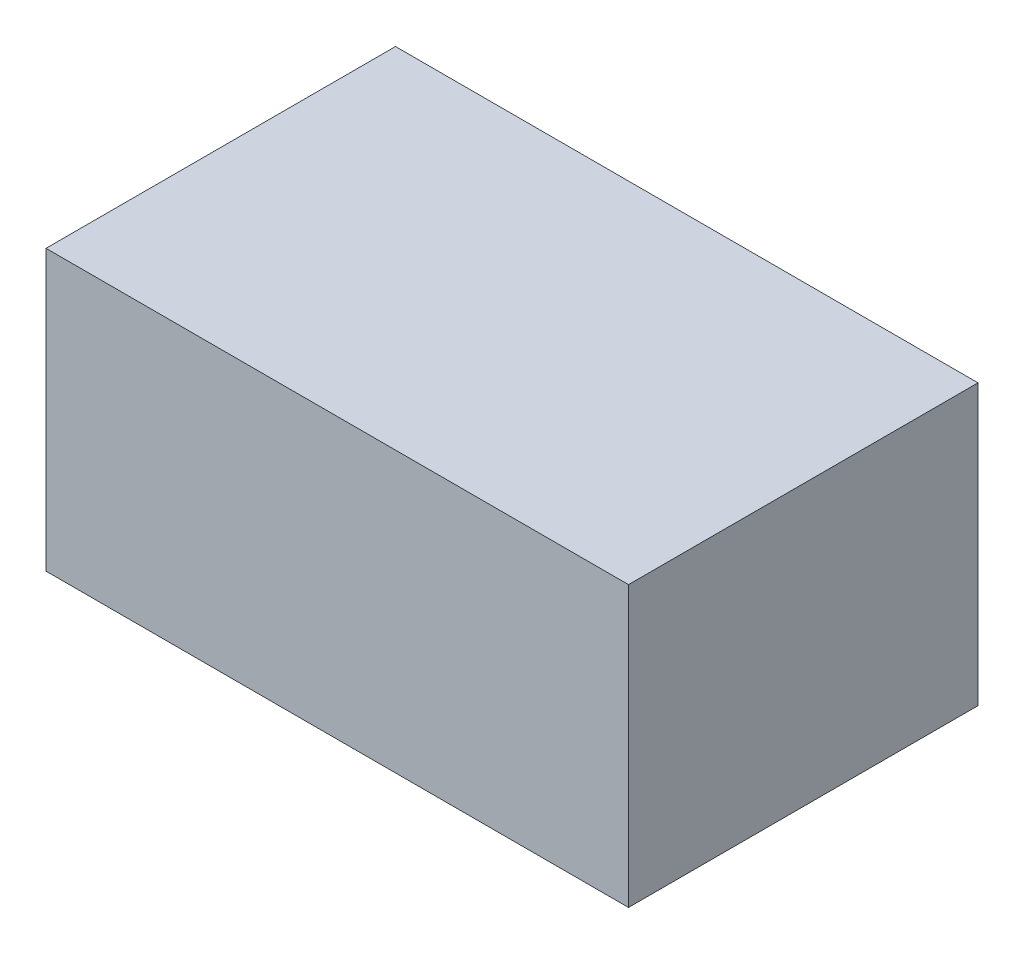
ISO-10303-21;
HEADER;
FILE_DESCRIPTION(('STEP AP214'),'2;1');
FILE_NAME('part.step','',(''),(''),'','','');
FILE_SCHEMA(('AUTOMOTIVE_DESIGN { 1 0 10303 214 1 1 1 1 }'));
ENDSEC;
DATA;
#1=APPLICATION_CONTEXT('core data for automotive mechanical design processes');
#2=APPLICATION_PROTOCOL_DEFINITION('international standard','automotive_design',2000,#1);
#3=PRODUCT_CONTEXT('',#1,'mechanical');
#4=PRODUCT('Part','Part','',(#3));
#5=PRODUCT_RELATED_PRODUCT_CATEGORY('part','',(#4));
#6=PRODUCT_DEFINITION_FORMATION('','',#4);
#7=PRODUCT_DEFINITION_CONTEXT('part definition',#1,'design');
#8=PRODUCT_DEFINITION('design','',#6,#7);
#9=PRODUCT_DEFINITION_SHAPE('','',#8);
#10=(LENGTH_UNIT() NAMED_UNIT(*) SI_UNIT(.MILLI.,.METRE.));
#11=(NAMED_UNIT(*) PLANE_ANGLE_UNIT() SI_UNIT($,.RADIAN.));
#12=(NAMED_UNIT(*) SI_UNIT($,.STERADIAN.) SOLID_ANGLE_UNIT());
#13=UNCERTAINTY_MEASURE_WITH_UNIT(LENGTH_MEASURE(1.E-05),#10,'distance_accuracy_value','');
#14=(GEOMETRIC_REPRESENTATION_CONTEXT(3) GLOBAL_UNCERTAINTY_ASSIGNED_CONTEXT((#13)) GLOBAL_UNIT_ASSIGNED_CONTEXT((#10,
#11,#12)) REPRESENTATION_CONTEXT('',''));
#15=CARTESIAN_POINT('',(0.,0.,0.));
#16=DIRECTION('',(0.,0.,1.));
#17=DIRECTION('',(1.,0.,0.));
#18=AXIS2_PLACEMENT_3D('',#15,#16,#17);
#19=CARTESIAN_POINT('',(-0.5,0.48,0.3));
#20=DIRECTION('',(1.,0.,0.));
#21=DIRECTION('',(0.,1.,0.));
#22=AXIS2_PLACEMENT_3D('',#19,#20,#21);
#23=PLANE('',#22);
#24=DIRECTION('',(0.,0.,1.));
#25=VECTOR('',#24,1.);
#26=CARTESIAN_POINT('',(-0.5,0.,0.3));
#27=LINE('',#26,#25);
#28=CARTESIAN_POINT('',(-0.5,0.,-0.3));
#29=VERTEX_POINT('',#28);
#30=CARTESIAN_POINT('',(-0.5,0.,0.3));
#31=VERTEX_POINT('',#30);
#32=EDGE_CURVE('P0_E11',#29,#31,#27,.T.);
#33=ORIENTED_EDGE('',*,*,#32,.T.);
#34=DIRECTION('',(0.,-1.,0.));
#35=VECTOR('',#34,1.);
#36=CARTESIAN_POINT('',(-0.5,0.48,0.3));
#37=LINE('',#36,#35);
#38=CARTESIAN_POINT('',(-0.5,0.48,0.3));
#39=VERTEX_POINT('',#38);
#40=EDGE_CURVE('P0_E42',#39,#31,#37,.T.);
#41=ORIENTED_EDGE('',*,*,#40,.F.);
#42=DIRECTION('',(0.,0.,1.));
#43=VECTOR('',#42,1.);
#44=CARTESIAN_POINT('',(-0.5,0.48,0.3));
#45=LINE('',#44,#43);
#46=CARTESIAN_POINT('',(-0.5,0.48,-0.3));
#47=VERTEX_POINT('',#46);
#48=EDGE_CURVE('P0_E88',#47,#39,#45,.T.);
#49=ORIENTED_EDGE('',*,*,#48,.F.);
#50=DIRECTION('',(0.,-1.,0.));
#51=VECTOR('',#50,1.);
#52=CARTESIAN_POINT('',(-0.5,0.48,-0.3));
#53=LINE('',#52,#51);
#54=EDGE_CURVE('P0_E28',#47,#29,#53,.T.);
#55=ORIENTED_EDGE('',*,*,#54,.T.);
#56=EDGE_LOOP('',(#33,#41,#49,#55));
#57=FACE_BOUND('',#56,.T.);
#58=ADVANCED_FACE('P0_F17',(#57),#23,.F.);
#59=CARTESIAN_POINT('',(0.5,0.48,0.3));
#60=DIRECTION('',(0.,0.,-1.));
#61=DIRECTION('',(-1.,0.,0.));
#62=AXIS2_PLACEMENT_3D('',#59,#60,#61);
#63=PLANE('',#62);
#64=DIRECTION('',(1.,0.,0.));
#65=VECTOR('',#64,1.);
#66=CARTESIAN_POINT('',(0.5,0.,0.3));
#67=LINE('',#66,#65);
#68=CARTESIAN_POINT('',(0.5,0.,0.3));
#69=VERTEX_POINT('',#68);
#70=EDGE_CURVE('P0_E101',#31,#69,#67,.T.);
#71=ORIENTED_EDGE('',*,*,#70,.T.);
#72=DIRECTION('',(0.,-1.,0.));
#73=VECTOR('',#72,1.);
#74=CARTESIAN_POINT('',(0.5,0.48,0.3));
#75=LINE('',#74,#73);
#76=CARTESIAN_POINT('',(0.5,0.48,0.3));
#77=VERTEX_POINT('',#76);
#78=EDGE_CURVE('P0_E103',#77,#69,#75,.T.);
#79=ORIENTED_EDGE('',*,*,#78,.F.);
#80=DIRECTION('',(1.,0.,0.));
#81=VECTOR('',#80,1.);
#82=CARTESIAN_POINT('',(0.5,0.48,0.3));
#83=LINE('',#82,#81);
#84=EDGE_CURVE('P0_E77',#39,#77,#83,.T.);
#85=ORIENTED_EDGE('',*,*,#84,.F.);
#86=ORIENTED_EDGE('',*,*,#40,.T.);
#87=EDGE_LOOP('',(#71,#79,#85,#86));
#88=FACE_BOUND('',#87,.T.);
#89=ADVANCED_FACE('P0_F19',(#88),#63,.F.);
#90=CARTESIAN_POINT('',(0.5,0.48,0.3));
#91=DIRECTION('',(-1.,0.,0.));
#92=DIRECTION('',(0.,0.,1.));
#93=AXIS2_PLACEMENT_3D('',#90,#91,#92);
#94=PLANE('',#93);
#95=DIRECTION('',(0.,0.,-1.));
#96=VECTOR('',#95,1.);
#97=CARTESIAN_POINT('',(0.5,0.,0.3));
#98=LINE('',#97,#96);
#99=CARTESIAN_POINT('',(0.5,0.,-0.3));
#100=VERTEX_POINT('',#99);
#101=EDGE_CURVE('P0_E21',#69,#100,#98,.T.);
#102=ORIENTED_EDGE('',*,*,#101,.T.);
#103=DIRECTION('',(0.,-1.,0.));
#104=VECTOR('',#103,1.);
#105=CARTESIAN_POINT('',(0.5,0.48,-0.3));
#106=LINE('',#105,#104);
#107=CARTESIAN_POINT('',(0.5,0.48,-0.3));
#108=VERTEX_POINT('',#107);
#109=EDGE_CURVE('P0_E66',#108,#100,#106,.T.);
#110=ORIENTED_EDGE('',*,*,#109,.F.);
#111=DIRECTION('',(0.,0.,-1.));
#112=VECTOR('',#111,1.);
#113=CARTESIAN_POINT('',(0.5,0.48,0.3));
#114=LINE('',#113,#112);
#115=EDGE_CURVE('P0_E74',#77,#108,#114,.T.);
#116=ORIENTED_EDGE('',*,*,#115,.F.);
#117=ORIENTED_EDGE('',*,*,#78,.T.);
#118=EDGE_LOOP('',(#102,#110,#116,#117));
#119=FACE_BOUND('',#118,.T.);
#120=ADVANCED_FACE('P0_F83',(#119),#94,.F.);
#121=CARTESIAN_POINT('',(0.5,0.48,-0.3));
#122=DIRECTION('',(0.,0.,1.));
#123=DIRECTION('',(1.,0.,0.));
#124=AXIS2_PLACEMENT_3D('',#121,#122,#123);
#125=PLANE('',#124);
#126=DIRECTION('',(-1.,0.,0.));
#127=VECTOR('',#126,1.);
#128=CARTESIAN_POINT('',(0.5,0.,-0.3));
#129=LINE('',#128,#127);
#130=EDGE_CURVE('P0_E87',#100,#29,#129,.T.);
#131=ORIENTED_EDGE('',*,*,#130,.T.);
#132=ORIENTED_EDGE('',*,*,#54,.F.);
#133=DIRECTION('',(-1.,0.,0.));
#134=VECTOR('',#133,1.);
#135=CARTESIAN_POINT('',(0.5,0.48,-0.3));
#136=LINE('',#135,#134);
#137=EDGE_CURVE('P0_E76',#108,#47,#136,.T.);
#138=ORIENTED_EDGE('',*,*,#137,.F.);
#139=ORIENTED_EDGE('',*,*,#109,.T.);
#140=EDGE_LOOP('',(#131,#132,#138,#139));
#141=FACE_BOUND('',#140,.T.);
#142=ADVANCED_FACE('P0_F91',(#141),#125,.F.);
#143=CARTESIAN_POINT('',(0.,0.48,0.));
#144=DIRECTION('',(0.,1.,0.));
#145=DIRECTION('',(1.,0.,0.));
#146=AXIS2_PLACEMENT_3D('',#143,#144,#145);
#147=PLANE('',#146);
#148=ORIENTED_EDGE('',*,*,#48,.T.);
#149=ORIENTED_EDGE('',*,*,#84,.T.);
#150=ORIENTED_EDGE('',*,*,#115,.T.);
#151=ORIENTED_EDGE('',*,*,#137,.T.);
#152=EDGE_LOOP('',(#148,#149,#150,#151));
#153=FACE_BOUND('',#152,.T.);
#154=ADVANCED_FACE('P0_F75',(#153),#147,.T.);
#155=CARTESIAN_POINT('',(0.,0.,0.));
#156=DIRECTION('',(0.,1.,0.));
#157=DIRECTION('',(1.,0.,0.));
#158=AXIS2_PLACEMENT_3D('',#155,#156,#157);
#159=PLANE('',#158);
#160=ORIENTED_EDGE('',*,*,#32,.F.);
#161=ORIENTED_EDGE('',*,*,#130,.F.);
#162=ORIENTED_EDGE('',*,*,#101,.F.);
#163=ORIENTED_EDGE('',*,*,#70,.F.);
#164=EDGE_LOOP('',(#160,#161,#162,#163));
#165=FACE_BOUND('',#164,.T.);
#166=ADVANCED_FACE('P0_F120',(#165),#159,.F.);
#167=CLOSED_SHELL('',(#58,#89,#120,#142,#154,#166));
#168=MANIFOLD_SOLID_BREP('P0_B1',#167);
#169=CARTESIAN_POINT('',(-0.45,-0.05,-0.25));
#170=DIRECTION('',(1.,0.,0.));
#171=DIRECTION('',(0.,1.,0.));
#172=AXIS2_PLACEMENT_3D('',#169,#170,#171);
#173=PLANE('',#172);
#174=DIRECTION('',(0.,0.,-1.));
#175=VECTOR('',#174,1.);
#176=CARTESIAN_POINT('',(-0.45,0.,-0.25));
#177=LINE('',#176,#175);
#178=CARTESIAN_POINT('',(-0.45,0.,0.25));
#179=VERTEX_POINT('',#178);
#180=CARTESIAN_POINT('',(-0.45,0.,-0.25));
#181=VERTEX_POINT('',#180);
#182=EDGE_CURVE('P1_E11',#179,#181,#177,.T.);
#183=ORIENTED_EDGE('',*,*,#182,.T.);
#184=DIRECTION('',(0.,1.,0.));
#185=VECTOR('',#184,1.);
#186=CARTESIAN_POINT('',(-0.45,-0.05,-0.25));
#187=LINE('',#186,#185);
#188=CARTESIAN_POINT('',(-0.45,-0.05,-0.25));
#189=VERTEX_POINT('',#188);
#190=EDGE_CURVE('P1_E41',#189,#181,#187,.T.);
#191=ORIENTED_EDGE('',*,*,#190,.F.);
#192=DIRECTION('',(0.,0.,-1.));
#193=VECTOR('',#192,1.);
#194=CARTESIAN_POINT('',(-0.45,-0.05,-0.25));
#195=LINE('',#194,#193);
#196=CARTESIAN_POINT('',(-0.45,-0.05,0.25));
#197=VERTEX_POINT('',#196);
#198=EDGE_CURVE('P1_E80',#197,#189,#195,.T.);
#199=ORIENTED_EDGE('',*,*,#198,.F.);
#200=DIRECTION('',(0.,1.,0.));
#201=VECTOR('',#200,1.);
#202=CARTESIAN_POINT('',(-0.45,-0.05,0.25));
#203=LINE('',#202,#201);
#204=EDGE_CURVE('P1_E21',#197,#179,#203,.T.);
#205=ORIENTED_EDGE('',*,*,#204,.T.);
#206=EDGE_LOOP('',(#183,#191,#199,#205));
#207=FACE_BOUND('',#206,.T.);
#208=ADVANCED_FACE('P1_F17',(#207),#173,.F.);
#209=CARTESIAN_POINT('',(-0.2,-0.05,-0.25));
#210=DIRECTION('',(0.,0.,1.));
#211=DIRECTION('',(1.,0.,0.));
#212=AXIS2_PLACEMENT_3D('',#209,#210,#211);
#213=PLANE('',#212);
#214=DIRECTION('',(1.,0.,0.));
#215=VECTOR('',#214,1.);
#216=CARTESIAN_POINT('',(-0.2,0.,-0.25));
#217=LINE('',#216,#215);
#218=CARTESIAN_POINT('',(-0.2,0.,-0.25));
#219=VERTEX_POINT('',#218);
#220=EDGE_CURVE('P1_E110',#181,#219,#217,.T.);
#221=ORIENTED_EDGE('',*,*,#220,.T.);
#222=DIRECTION('',(0.,1.,0.));
#223=VECTOR('',#222,1.);
#224=CARTESIAN_POINT('',(-0.2,-0.05,-0.25));
#225=LINE('',#224,#223);
#226=CARTESIAN_POINT('',(-0.2,-0.05,-0.25));
#227=VERTEX_POINT('',#226);
#228=EDGE_CURVE('P1_E85',#227,#219,#225,.T.);
#229=ORIENTED_EDGE('',*,*,#228,.F.);
#230=DIRECTION('',(1.,0.,0.));
#231=VECTOR('',#230,1.);
#232=CARTESIAN_POINT('',(-0.2,-0.05,-0.25));
#233=LINE('',#232,#231);
#234=EDGE_CURVE('P1_E101',#189,#227,#233,.T.);
#235=ORIENTED_EDGE('',*,*,#234,.F.);
#236=ORIENTED_EDGE('',*,*,#190,.T.);
#237=EDGE_LOOP('',(#221,#229,#235,#236));
#238=FACE_BOUND('',#237,.T.);
#239=ADVANCED_FACE('P1_F109',(#238),#213,.F.);
#240=CARTESIAN_POINT('',(-0.2,-0.05,-0.25));
#241=DIRECTION('',(-1.,0.,0.));
#242=DIRECTION('',(0.,1.,0.));
#243=AXIS2_PLACEMENT_3D('',#240,#241,#242);
#244=PLANE('',#243);
#245=DIRECTION('',(0.,0.,1.));
#246=VECTOR('',#245,1.);
#247=CARTESIAN_POINT('',(-0.2,0.,-0.25));
#248=LINE('',#247,#246);
#249=CARTESIAN_POINT('',(-0.2,0.,0.25));
#250=VERTEX_POINT('',#249);
#251=EDGE_CURVE('P1_E83',#219,#250,#248,.T.);
#252=ORIENTED_EDGE('',*,*,#251,.T.);
#253=DIRECTION('',(0.,1.,0.));
#254=VECTOR('',#253,1.);
#255=CARTESIAN_POINT('',(-0.2,-0.05,0.25));
#256=LINE('',#255,#254);
#257=CARTESIAN_POINT('',(-0.2,-0.05,0.25));
#258=VERTEX_POINT('',#257);
#259=EDGE_CURVE('P1_E69',#258,#250,#256,.T.);
#260=ORIENTED_EDGE('',*,*,#259,.F.);
#261=DIRECTION('',(0.,0.,1.));
#262=VECTOR('',#261,1.);
#263=CARTESIAN_POINT('',(-0.2,-0.05,-0.25));
#264=LINE('',#263,#262);
#265=EDGE_CURVE('P1_E102',#227,#258,#264,.T.);
#266=ORIENTED_EDGE('',*,*,#265,.F.);
#267=ORIENTED_EDGE('',*,*,#228,.T.);
#268=EDGE_LOOP('',(#252,#260,#266,#267));
#269=FACE_BOUND('',#268,.T.);
#270=ADVANCED_FACE('P1_F19',(#269),#244,.F.);
#271=CARTESIAN_POINT('',(-0.2,-0.05,0.25));
#272=DIRECTION('',(0.,0.,-1.));
#273=DIRECTION('',(0.,-1.,0.));
#274=AXIS2_PLACEMENT_3D('',#271,#272,#273);
#275=PLANE('',#274);
#276=DIRECTION('',(-1.,0.,0.));
#277=VECTOR('',#276,1.);
#278=CARTESIAN_POINT('',(-0.2,0.,0.25));
#279=LINE('',#278,#277);
#280=EDGE_CURVE('P1_E74',#250,#179,#279,.T.);
#281=ORIENTED_EDGE('',*,*,#280,.T.);
#282=ORIENTED_EDGE('',*,*,#204,.F.);
#283=DIRECTION('',(-1.,0.,0.));
#284=VECTOR('',#283,1.);
#285=CARTESIAN_POINT('',(-0.2,-0.05,0.25));
#286=LINE('',#285,#284);
#287=EDGE_CURVE('P1_E76',#258,#197,#286,.T.);
#288=ORIENTED_EDGE('',*,*,#287,.F.);
#289=ORIENTED_EDGE('',*,*,#259,.T.);
#290=EDGE_LOOP('',(#281,#282,#288,#289));
#291=FACE_BOUND('',#290,.T.);
#292=ADVANCED_FACE('P1_F71',(#291),#275,.F.);
#293=CARTESIAN_POINT('',(0.,-0.05,0.));
#294=DIRECTION('',(0.,-1.,0.));
#295=DIRECTION('',(0.,0.,-1.));
#296=AXIS2_PLACEMENT_3D('',#293,#294,#295);
#297=PLANE('',#296);
#298=ORIENTED_EDGE('',*,*,#198,.T.);
#299=ORIENTED_EDGE('',*,*,#234,.T.);
#300=ORIENTED_EDGE('',*,*,#265,.T.);
#301=ORIENTED_EDGE('',*,*,#287,.T.);
#302=EDGE_LOOP('',(#298,#299,#300,#301));
#303=FACE_BOUND('',#302,.T.);
#304=ADVANCED_FACE('P1_F108',(#303),#297,.T.);
#305=CARTESIAN_POINT('',(0.,0.,0.));
#306=DIRECTION('',(0.,-1.,0.));
#307=DIRECTION('',(0.,0.,-1.));
#308=AXIS2_PLACEMENT_3D('',#305,#306,#307);
#309=PLANE('',#308);
#310=ORIENTED_EDGE('',*,*,#182,.F.);
#311=ORIENTED_EDGE('',*,*,#280,.F.);
#312=ORIENTED_EDGE('',*,*,#251,.F.);
#313=ORIENTED_EDGE('',*,*,#220,.F.);
#314=EDGE_LOOP('',(#310,#311,#312,#313));
#315=FACE_BOUND('',#314,.T.);
#316=ADVANCED_FACE('P1_F91',(#315),#309,.F.);
#317=CLOSED_SHELL('',(#208,#239,#270,#292,#304,#316));
#318=MANIFOLD_SOLID_BREP('P1_B1',#317);
#319=CARTESIAN_POINT('',(0.2,-0.05,-0.25));
#320=DIRECTION('',(1.,0.,0.));
#321=DIRECTION('',(0.,0.,1.));
#322=AXIS2_PLACEMENT_3D('',#319,#320,#321);
#323=PLANE('',#322);
#324=DIRECTION('',(0.,0.,-1.));
#325=VECTOR('',#324,1.);
#326=CARTESIAN_POINT('',(0.2,0.,-0.25));
#327=LINE('',#326,#325);
#328=CARTESIAN_POINT('',(0.2,0.,0.25));
#329=VERTEX_POINT('',#328);
#330=CARTESIAN_POINT('',(0.2,0.,-0.25));
#331=VERTEX_POINT('',#330);
#332=EDGE_CURVE('P2_E11',#329,#331,#327,.T.);
#333=ORIENTED_EDGE('',*,*,#332,.T.);
#334=DIRECTION('',(0.,1.,0.));
#335=VECTOR('',#334,1.);
#336=CARTESIAN_POINT('',(0.2,-0.05,-0.25));
#337=LINE('',#336,#335);
#338=CARTESIAN_POINT('',(0.2,-0.05,-0.25));
#339=VERTEX_POINT('',#338);
#340=EDGE_CURVE('P2_E42',#339,#331,#337,.T.);
#341=ORIENTED_EDGE('',*,*,#340,.F.);
#342=DIRECTION('',(0.,0.,-1.));
#343=VECTOR('',#342,1.);
#344=CARTESIAN_POINT('',(0.2,-0.05,-0.25));
#345=LINE('',#344,#343);
#346=CARTESIAN_POINT('',(0.2,-0.05,0.25));
#347=VERTEX_POINT('',#346);
#348=EDGE_CURVE('P2_E21',#347,#339,#345,.T.);
#349=ORIENTED_EDGE('',*,*,#348,.F.);
#350=DIRECTION('',(0.,1.,0.));
#351=VECTOR('',#350,1.);
#352=CARTESIAN_POINT('',(0.2,-0.05,0.25));
#353=LINE('',#352,#351);
#354=EDGE_CURVE('P2_E28',#347,#329,#353,.T.);
#355=ORIENTED_EDGE('',*,*,#354,.T.);
#356=EDGE_LOOP('',(#333,#341,#349,#355));
#357=FACE_BOUND('',#356,.T.);
#358=ADVANCED_FACE('P2_F17',(#357),#323,.F.);
#359=CARTESIAN_POINT('',(0.2,-0.05,-0.25));
#360=DIRECTION('',(0.,0.,1.));
#361=DIRECTION('',(1.,0.,0.));
#362=AXIS2_PLACEMENT_3D('',#359,#360,#361);
#363=PLANE('',#362);
#364=DIRECTION('',(1.,0.,0.));
#365=VECTOR('',#364,1.);
#366=CARTESIAN_POINT('',(0.2,0.,-0.25));
#367=LINE('',#366,#365);
#368=CARTESIAN_POINT('',(0.45,0.,-0.25));
#369=VERTEX_POINT('',#368);
#370=EDGE_CURVE('P2_E107',#331,#369,#367,.T.);
#371=ORIENTED_EDGE('',*,*,#370,.T.);
#372=DIRECTION('',(0.,1.,0.));
#373=VECTOR('',#372,1.);
#374=CARTESIAN_POINT('',(0.45,-0.05,-0.25));
#375=LINE('',#374,#373);
#376=CARTESIAN_POINT('',(0.45,-0.05,-0.25));
#377=VERTEX_POINT('',#376);
#378=EDGE_CURVE('P2_E112',#377,#369,#375,.T.);
#379=ORIENTED_EDGE('',*,*,#378,.F.);
#380=DIRECTION('',(1.,0.,0.));
#381=VECTOR('',#380,1.);
#382=CARTESIAN_POINT('',(0.2,-0.05,-0.25));
#383=LINE('',#382,#381);
#384=EDGE_CURVE('P2_E123',#339,#377,#383,.T.);
#385=ORIENTED_EDGE('',*,*,#384,.F.);
#386=ORIENTED_EDGE('',*,*,#340,.T.);
#387=EDGE_LOOP('',(#371,#379,#385,#386));
#388=FACE_BOUND('',#387,.T.);
#389=ADVANCED_FACE('P2_F137',(#388),#363,.F.);
#390=CARTESIAN_POINT('',(0.45,-0.05,-0.25));
#391=DIRECTION('',(-1.,0.,0.));
#392=DIRECTION('',(0.,0.,1.));
#393=AXIS2_PLACEMENT_3D('',#390,#391,#392);
#394=PLANE('',#393);
#395=DIRECTION('',(0.,0.,1.));
#396=VECTOR('',#395,1.);
#397=CARTESIAN_POINT('',(0.45,0.,-0.25));
#398=LINE('',#397,#396);
#399=CARTESIAN_POINT('',(0.45,0.,0.15));
#400=VERTEX_POINT('',#399);
#401=EDGE_CURVE('P2_E108',#369,#400,#398,.T.);
#402=ORIENTED_EDGE('',*,*,#401,.T.);
#403=DIRECTION('',(0.,1.,0.));
#404=VECTOR('',#403,1.);
#405=CARTESIAN_POINT('',(0.45,-0.05,0.15));
#406=LINE('',#405,#404);
#407=CARTESIAN_POINT('',(0.45,-0.05,0.15));
#408=VERTEX_POINT('',#407);
#409=EDGE_CURVE('P2_E115',#408,#400,#406,.T.);
#410=ORIENTED_EDGE('',*,*,#409,.F.);
#411=DIRECTION('',(0.,0.,1.));
#412=VECTOR('',#411,1.);
#413=CARTESIAN_POINT('',(0.45,-0.05,-0.25));
#414=LINE('',#413,#412);
#415=EDGE_CURVE('P2_E82',#377,#408,#414,.T.);
#416=ORIENTED_EDGE('',*,*,#415,.F.);
#417=ORIENTED_EDGE('',*,*,#378,.T.);
#418=EDGE_LOOP('',(#402,#410,#416,#417));
#419=FACE_BOUND('',#418,.T.);
#420=ADVANCED_FACE('P2_F134',(#419),#394,.F.);
#421=CARTESIAN_POINT('',(0.45,-0.05,0.25));
#422=DIRECTION('',(0.,1.,0.));
#423=DIRECTION('',(0.,0.,1.));
#424=AXIS2_PLACEMENT_3D('',#421,#422,#423);
#425=CYLINDRICAL_SURFACE('',#424,0.1);
#426=CARTESIAN_POINT('',(0.45,0.,0.25));
#427=DIRECTION('',(0.,1.,0.));
#428=DIRECTION('',(0.,0.,-1.));
#429=AXIS2_PLACEMENT_3D('',#426,#427,#428);
#430=CIRCLE('',#429,0.1);
#431=CARTESIAN_POINT('',(0.35,0.,0.25));
#432=VERTEX_POINT('',#431);
#433=EDGE_CURVE('P2_E91',#400,#432,#430,.T.);
#434=ORIENTED_EDGE('',*,*,#433,.T.);
#435=DIRECTION('',(0.,1.,0.));
#436=VECTOR('',#435,1.);
#437=CARTESIAN_POINT('',(0.35,-0.05,0.25));
#438=LINE('',#437,#436);
#439=CARTESIAN_POINT('',(0.35,-0.05,0.25));
#440=VERTEX_POINT('',#439);
#441=EDGE_CURVE('P2_E89',#440,#432,#438,.T.);
#442=ORIENTED_EDGE('',*,*,#441,.F.);
#443=CARTESIAN_POINT('',(0.45,-0.05,0.25));
#444=DIRECTION('',(0.,1.,0.));
#445=DIRECTION('',(0.,0.,-1.));
#446=AXIS2_PLACEMENT_3D('',#443,#444,#445);
#447=CIRCLE('',#446,0.1);
#448=EDGE_CURVE('P2_E76',#408,#440,#447,.T.);
#449=ORIENTED_EDGE('',*,*,#448,.F.);
#450=ORIENTED_EDGE('',*,*,#409,.T.);
#451=EDGE_LOOP('',(#434,#442,#449,#450));
#452=FACE_BOUND('',#451,.T.);
#453=ADVANCED_FACE('P2_F19',(#452),#425,.F.);
#454=CARTESIAN_POINT('',(0.2,-0.05,0.25));
#455=DIRECTION('',(0.,0.,-1.));
#456=DIRECTION('',(0.,-1.,0.));
#457=AXIS2_PLACEMENT_3D('',#454,#455,#456);
#458=PLANE('',#457);
#459=DIRECTION('',(-1.,0.,0.));
#460=VECTOR('',#459,1.);
#461=CARTESIAN_POINT('',(0.2,0.,0.25));
#462=LINE('',#461,#460);
#463=EDGE_CURVE('P2_E96',#432,#329,#462,.T.);
#464=ORIENTED_EDGE('',*,*,#463,.T.);
#465=ORIENTED_EDGE('',*,*,#354,.F.);
#466=DIRECTION('',(-1.,0.,0.));
#467=VECTOR('',#466,1.);
#468=CARTESIAN_POINT('',(0.2,-0.05,0.25));
#469=LINE('',#468,#467);
#470=EDGE_CURVE('P2_E80',#440,#347,#469,.T.);
#471=ORIENTED_EDGE('',*,*,#470,.F.);
#472=ORIENTED_EDGE('',*,*,#441,.T.);
#473=EDGE_LOOP('',(#464,#465,#471,#472));
#474=FACE_BOUND('',#473,.T.);
#475=ADVANCED_FACE('P2_F99',(#474),#458,.F.);
#476=CARTESIAN_POINT('',(0.45,-0.05,0.25));
#477=DIRECTION('',(0.,-1.,0.));
#478=DIRECTION('',(0.,0.,-1.));
#479=AXIS2_PLACEMENT_3D('',#476,#477,#478);
#480=PLANE('',#479);
#481=ORIENTED_EDGE('',*,*,#348,.T.);
#482=ORIENTED_EDGE('',*,*,#384,.T.);
#483=ORIENTED_EDGE('',*,*,#415,.T.);
#484=ORIENTED_EDGE('',*,*,#448,.T.);
#485=ORIENTED_EDGE('',*,*,#470,.T.);
#486=EDGE_LOOP('',(#481,#482,#483,#484,#485));
#487=FACE_BOUND('',#486,.T.);
#488=ADVANCED_FACE('P2_F78',(#487),#480,.T.);
#489=CARTESIAN_POINT('',(0.45,0.,0.25));
#490=DIRECTION('',(0.,-1.,0.));
#491=DIRECTION('',(0.,0.,-1.));
#492=AXIS2_PLACEMENT_3D('',#489,#490,#491);
#493=PLANE('',#492);
#494=ORIENTED_EDGE('',*,*,#332,.F.);
#495=ORIENTED_EDGE('',*,*,#463,.F.);
#496=ORIENTED_EDGE('',*,*,#433,.F.);
#497=ORIENTED_EDGE('',*,*,#401,.F.);
#498=ORIENTED_EDGE('',*,*,#370,.F.);
#499=EDGE_LOOP('',(#494,#495,#496,#497,#498));
#500=FACE_BOUND('',#499,.T.);
#501=ADVANCED_FACE('P2_F140',(#500),#493,.F.);
#502=CLOSED_SHELL('',(#358,#389,#420,#453,#475,#488,#501));
#503=MANIFOLD_SOLID_BREP('P2_B1',#502);
#504=ADVANCED_BREP_SHAPE_REPRESENTATION('',(#18,#168,#318,#503),#14);
#505=SHAPE_DEFINITION_REPRESENTATION(#9,#504);
ENDSEC;
END-ISO-10303-21;
